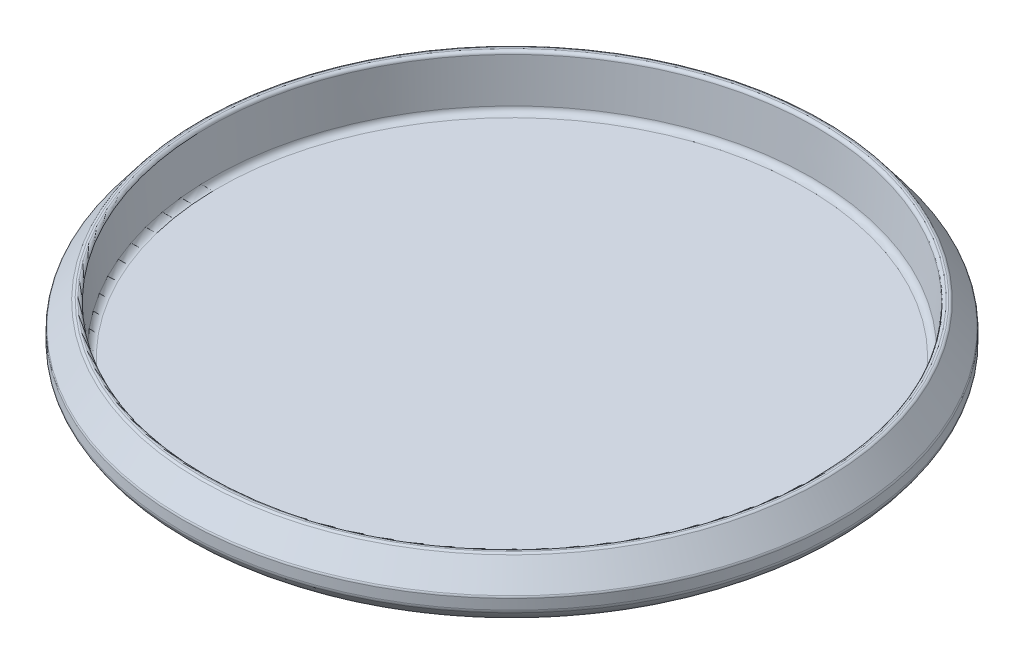
ISO-10303-21;
HEADER;
FILE_DESCRIPTION(('STEP AP214'),'2;1');
FILE_NAME('part.step','',(''),(''),'','','');
FILE_SCHEMA(('AUTOMOTIVE_DESIGN { 1 0 10303 214 1 1 1 1 }'));
ENDSEC;
DATA;
#1=APPLICATION_CONTEXT('core data for automotive mechanical design processes');
#2=APPLICATION_PROTOCOL_DEFINITION('international standard','automotive_design',2000,#1);
#3=PRODUCT_CONTEXT('',#1,'mechanical');
#4=PRODUCT('Part','Part','',(#3));
#5=PRODUCT_RELATED_PRODUCT_CATEGORY('part','',(#4));
#6=PRODUCT_DEFINITION_FORMATION('','',#4);
#7=PRODUCT_DEFINITION_CONTEXT('part definition',#1,'design');
#8=PRODUCT_DEFINITION('design','',#6,#7);
#9=PRODUCT_DEFINITION_SHAPE('','',#8);
#10=(LENGTH_UNIT() NAMED_UNIT(*) SI_UNIT(.MILLI.,.METRE.));
#11=(NAMED_UNIT(*) PLANE_ANGLE_UNIT() SI_UNIT($,.RADIAN.));
#12=(NAMED_UNIT(*) SI_UNIT($,.STERADIAN.) SOLID_ANGLE_UNIT());
#13=UNCERTAINTY_MEASURE_WITH_UNIT(LENGTH_MEASURE(1.E-05),#10,'distance_accuracy_value','');
#14=(GEOMETRIC_REPRESENTATION_CONTEXT(3) GLOBAL_UNCERTAINTY_ASSIGNED_CONTEXT((#13)) GLOBAL_UNIT_ASSIGNED_CONTEXT((#10,
#11,#12)) REPRESENTATION_CONTEXT('',''));
#15=CARTESIAN_POINT('',(0.,0.,0.));
#16=DIRECTION('',(0.,0.,1.));
#17=DIRECTION('',(1.,0.,0.));
#18=AXIS2_PLACEMENT_3D('',#15,#16,#17);
#19=CARTESIAN_POINT('',(0.,1.5,0.));
#20=DIRECTION('',(0.,1.,0.));
#21=DIRECTION('',(0.,0.,1.));
#22=AXIS2_PLACEMENT_3D('',#19,#20,#21);
#23=PLANE('',#22);
#24=CARTESIAN_POINT('',(0.,1.5,0.));
#25=DIRECTION('',(0.,1.,0.));
#26=DIRECTION('',(0.,0.,1.));
#27=AXIS2_PLACEMENT_3D('',#24,#25,#26);
#28=CIRCLE('',#27,93.1673376519652);
#29=CARTESIAN_POINT('',(0.,1.5,93.1673376519652));
#30=VERTEX_POINT('',#29);
#31=EDGE_CURVE('E10',#30,#30,#28,.T.);
#32=ORIENTED_EDGE('',*,*,#31,.T.);
#33=EDGE_LOOP('',(#32));
#34=FACE_BOUND('',#33,.T.);
#35=ADVANCED_FACE('F36',(#34),#23,.T.);
#36=CARTESIAN_POINT('',(0.,9.51678039252937,0.));
#37=DIRECTION('',(0.,-1.,0.));
#38=DIRECTION('',(0.,0.,-1.));
#39=AXIS2_PLACEMENT_3D('',#36,#37,#38);
#40=TOROIDAL_SURFACE('',#39,95.7578090940791,9.54690440209288);
#41=CARTESIAN_POINT('',(0.,5.13071645101927,0.));
#42=DIRECTION('',(0.,1.,0.));
#43=DIRECTION('',(0.,0.,1.));
#44=AXIS2_PLACEMENT_3D('',#41,#42,#43);
#45=CIRCLE('',#44,104.237539441424);
#46=CARTESIAN_POINT('',(0.,5.13071645101927,104.237539441424));
#47=VERTEX_POINT('',#46);
#48=EDGE_CURVE('E54',#47,#47,#45,.F.);
#49=ORIENTED_EDGE('',*,*,#48,.T.);
#50=EDGE_LOOP('',(#49));
#51=FACE_BOUND('',#50,.T.);
#52=CARTESIAN_POINT('',(0.,0.,0.));
#53=DIRECTION('',(0.,1.,0.));
#54=DIRECTION('',(0.,0.,1.));
#55=AXIS2_PLACEMENT_3D('',#52,#53,#54);
#56=CIRCLE('',#55,95.);
#57=CARTESIAN_POINT('',(0.,0.,95.));
#58=VERTEX_POINT('',#57);
#59=EDGE_CURVE('E84',#58,#58,#56,.T.);
#60=ORIENTED_EDGE('',*,*,#59,.T.);
#61=EDGE_LOOP('',(#60));
#62=FACE_BOUND('',#61,.T.);
#63=ADVANCED_FACE('F89',(#51,#62),#40,.T.);
#64=CARTESIAN_POINT('',(0.,0.,0.));
#65=DIRECTION('',(0.,-1.,0.));
#66=DIRECTION('',(0.,0.,-1.));
#67=AXIS2_PLACEMENT_3D('',#64,#65,#66);
#68=CYLINDRICAL_SURFACE('',#67,104.461103857658);
#69=CARTESIAN_POINT('',(0.,6.04956171368853,0.));
#70=DIRECTION('',(0.,1.,0.));
#71=DIRECTION('',(0.,0.,1.));
#72=AXIS2_PLACEMENT_3D('',#69,#70,#71);
#73=CIRCLE('',#72,104.461103857658);
#74=CARTESIAN_POINT('',(0.,6.04956171368853,104.461103857658));
#75=VERTEX_POINT('',#74);
#76=EDGE_CURVE('E49',#75,#75,#73,.T.);
#77=ORIENTED_EDGE('',*,*,#76,.T.);
#78=EDGE_LOOP('',(#77));
#79=FACE_BOUND('',#78,.T.);
#80=CARTESIAN_POINT('',(0.,9.25570026220736,0.));
#81=DIRECTION('',(0.,1.,0.));
#82=DIRECTION('',(0.,0.,1.));
#83=AXIS2_PLACEMENT_3D('',#80,#81,#82);
#84=CIRCLE('',#83,104.461103857658);
#85=CARTESIAN_POINT('',(0.,9.25570026220736,104.461103857658));
#86=VERTEX_POINT('',#85);
#87=EDGE_CURVE('E64',#86,#86,#84,.F.);
#88=ORIENTED_EDGE('',*,*,#87,.T.);
#89=EDGE_LOOP('',(#88));
#90=FACE_BOUND('',#89,.T.);
#91=ADVANCED_FACE('F112',(#79,#90),#68,.T.);
#92=CARTESIAN_POINT('',(0.,9.5930011019782,0.));
#93=DIRECTION('',(0.,-1.,0.));
#94=DIRECTION('',(0.,0.,-1.));
#95=AXIS2_PLACEMENT_3D('',#92,#93,#94);
#96=CONICAL_SURFACE('',#95,104.461103857658,0.650634100044437);
#97=CARTESIAN_POINT('',(0.,9.86139134301403,0.));
#98=DIRECTION('',(0.,1.,0.));
#99=DIRECTION('',(0.,0.,1.));
#100=AXIS2_PLACEMENT_3D('',#97,#98,#99);
#101=CIRCLE('',#100,104.25680374746);
#102=CARTESIAN_POINT('',(0.,9.86139134301403,104.25680374746));
#103=VERTEX_POINT('',#102);
#104=EDGE_CURVE('E60',#103,#103,#101,.T.);
#105=ORIENTED_EDGE('',*,*,#104,.T.);
#106=EDGE_LOOP('',(#105));
#107=FACE_BOUND('',#106,.T.);
#108=CARTESIAN_POINT('',(0.,17.1556910808067,0.));
#109=DIRECTION('',(0.,1.,0.));
#110=DIRECTION('',(0.,0.,1.));
#111=AXIS2_PLACEMENT_3D('',#108,#109,#110);
#112=CIRCLE('',#111,98.7043431419799);
#113=CARTESIAN_POINT('',(0.,17.1556910808067,98.7043431419799));
#114=VERTEX_POINT('',#113);
#115=EDGE_CURVE('E68',#114,#114,#112,.F.);
#116=ORIENTED_EDGE('',*,*,#115,.T.);
#117=EDGE_LOOP('',(#116));
#118=FACE_BOUND('',#117,.T.);
#119=ADVANCED_FACE('F118',(#107,#118),#96,.T.);
#120=CARTESIAN_POINT('',(96.4041930495911,17.55,0.));
#121=DIRECTION('',(0.,1.,0.));
#122=DIRECTION('',(0.,0.,1.));
#123=AXIS2_PLACEMENT_3D('',#120,#121,#122);
#124=PLANE('',#123);
#125=CARTESIAN_POINT('',(0.,17.55,0.));
#126=DIRECTION('',(0.,1.,0.));
#127=DIRECTION('',(0.,0.,1.));
#128=AXIS2_PLACEMENT_3D('',#125,#126,#127);
#129=CIRCLE('',#128,97.3205242236085);
#130=CARTESIAN_POINT('',(0.,17.55,97.3205242236085));
#131=VERTEX_POINT('',#130);
#132=EDGE_CURVE('E76',#131,#131,#129,.F.);
#133=ORIENTED_EDGE('',*,*,#132,.T.);
#134=EDGE_LOOP('',(#133));
#135=FACE_BOUND('',#134,.T.);
#136=CARTESIAN_POINT('',(0.,17.55,0.));
#137=DIRECTION('',(0.,1.,0.));
#138=DIRECTION('',(0.,0.,1.));
#139=AXIS2_PLACEMENT_3D('',#136,#137,#138);
#140=CIRCLE('',#139,97.9086432521778);
#141=CARTESIAN_POINT('',(0.,17.55,97.9086432521778));
#142=VERTEX_POINT('',#141);
#143=EDGE_CURVE('E80',#142,#142,#140,.T.);
#144=ORIENTED_EDGE('',*,*,#143,.T.);
#145=EDGE_LOOP('',(#144));
#146=FACE_BOUND('',#145,.T.);
#147=ADVANCED_FACE('F104',(#135,#146),#124,.T.);
#148=CARTESIAN_POINT('',(0.,17.55,0.));
#149=DIRECTION('',(0.,1.,0.));
#150=DIRECTION('',(0.,0.,1.));
#151=AXIS2_PLACEMENT_3D('',#148,#149,#150);
#152=CONICAL_SURFACE('',#151,96.4041930495911,0.0872664625997164);
#153=CARTESIAN_POINT('',(0.,3.32568851450468,0.));
#154=DIRECTION('',(0.,1.,0.));
#155=DIRECTION('',(0.,0.,1.));
#156=AXIS2_PLACEMENT_3D('',#153,#154,#155);
#157=CIRCLE('',#156,95.1597270481487);
#158=CARTESIAN_POINT('',(0.,3.32568851450468,95.1597270481487));
#159=VERTEX_POINT('',#158);
#160=EDGE_CURVE('E44',#159,#159,#157,.F.);
#161=ORIENTED_EDGE('',*,*,#160,.T.);
#162=EDGE_LOOP('',(#161));
#163=FACE_BOUND('',#162,.T.);
#164=CARTESIAN_POINT('',(0.,16.6371557427476,0.));
#165=DIRECTION('',(0.,-1.,0.));
#166=DIRECTION('',(0.,0.,-1.));
#167=AXIS2_PLACEMENT_3D('',#164,#165,#166);
#168=CIRCLE('',#167,96.3243295255168);
#169=CARTESIAN_POINT('',(0.,16.6371557427476,-96.3243295255168));
#170=VERTEX_POINT('',#169);
#171=EDGE_CURVE('E72',#170,#170,#168,.F.);
#172=ORIENTED_EDGE('',*,*,#171,.T.);
#173=EDGE_LOOP('',(#172));
#174=FACE_BOUND('',#173,.T.);
#175=ADVANCED_FACE('F94',(#163,#174),#152,.F.);
#176=CARTESIAN_POINT('',(0.,0.,0.));
#177=DIRECTION('',(0.,1.,0.));
#178=DIRECTION('',(0.,0.,1.));
#179=AXIS2_PLACEMENT_3D('',#176,#177,#178);
#180=PLANE('',#179);
#181=ORIENTED_EDGE('',*,*,#59,.F.);
#182=EDGE_LOOP('',(#181));
#183=FACE_BOUND('',#182,.T.);
#184=ADVANCED_FACE('F91',(#183),#180,.F.);
#185=CARTESIAN_POINT('',(0.,16.55,0.));
#186=DIRECTION('',(0.,1.,0.));
#187=DIRECTION('',(0.,0.,1.));
#188=AXIS2_PLACEMENT_3D('',#185,#186,#187);
#189=TOROIDAL_SURFACE('',#188,97.3205242236085,1.);
#190=ORIENTED_EDGE('',*,*,#171,.F.);
#191=EDGE_LOOP('',(#190));
#192=FACE_BOUND('',#191,.T.);
#193=ORIENTED_EDGE('',*,*,#132,.F.);
#194=EDGE_LOOP('',(#193));
#195=FACE_BOUND('',#194,.T.);
#196=ADVANCED_FACE('F93',(#192,#195),#189,.T.);
#197=CARTESIAN_POINT('',(0.,16.55,0.));
#198=DIRECTION('',(0.,1.,0.));
#199=DIRECTION('',(0.,0.,1.));
#200=AXIS2_PLACEMENT_3D('',#197,#198,#199);
#201=TOROIDAL_SURFACE('',#200,97.9086432521778,1.);
#202=ORIENTED_EDGE('',*,*,#143,.F.);
#203=EDGE_LOOP('',(#202));
#204=FACE_BOUND('',#203,.T.);
#205=ORIENTED_EDGE('',*,*,#115,.F.);
#206=EDGE_LOOP('',(#205));
#207=FACE_BOUND('',#206,.T.);
#208=ADVANCED_FACE('F100',(#204,#207),#201,.T.);
#209=CARTESIAN_POINT('',(0.,9.25570026220736,0.));
#210=DIRECTION('',(0.,1.,0.));
#211=DIRECTION('',(0.,0.,1.));
#212=AXIS2_PLACEMENT_3D('',#209,#210,#211);
#213=TOROIDAL_SURFACE('',#212,103.461103857658,1.);
#214=ORIENTED_EDGE('',*,*,#104,.F.);
#215=EDGE_LOOP('',(#214));
#216=FACE_BOUND('',#215,.T.);
#217=ORIENTED_EDGE('',*,*,#87,.F.);
#218=EDGE_LOOP('',(#217));
#219=FACE_BOUND('',#218,.T.);
#220=ADVANCED_FACE('F133',(#216,#219),#213,.T.);
#221=CARTESIAN_POINT('',(0.,6.04956171368853,0.));
#222=DIRECTION('',(0.,1.,0.));
#223=DIRECTION('',(0.,0.,1.));
#224=AXIS2_PLACEMENT_3D('',#221,#222,#223);
#225=TOROIDAL_SURFACE('',#224,102.461103857658,2.);
#226=ORIENTED_EDGE('',*,*,#76,.F.);
#227=EDGE_LOOP('',(#226));
#228=FACE_BOUND('',#227,.T.);
#229=ORIENTED_EDGE('',*,*,#48,.F.);
#230=EDGE_LOOP('',(#229));
#231=FACE_BOUND('',#230,.T.);
#232=ADVANCED_FACE('F140',(#228,#231),#225,.T.);
#233=CARTESIAN_POINT('',(0.,3.5,0.));
#234=DIRECTION('',(0.,1.,0.));
#235=DIRECTION('',(0.,0.,1.));
#236=AXIS2_PLACEMENT_3D('',#233,#234,#235);
#237=TOROIDAL_SURFACE('',#236,93.1673376519652,2.);
#238=ORIENTED_EDGE('',*,*,#31,.F.);
#239=EDGE_LOOP('',(#238));
#240=FACE_BOUND('',#239,.T.);
#241=ORIENTED_EDGE('',*,*,#160,.F.);
#242=EDGE_LOOP('',(#241));
#243=FACE_BOUND('',#242,.T.);
#244=ADVANCED_FACE('F38',(#240,#243),#237,.F.);
#245=CLOSED_SHELL('',(#35,#63,#91,#119,#147,#175,#184,#196,#208,#220,#232,#244));
#246=MANIFOLD_SOLID_BREP('B2',#245);
#247=ADVANCED_BREP_SHAPE_REPRESENTATION('',(#18,#246),#14);
#248=SHAPE_DEFINITION_REPRESENTATION(#9,#247);
ENDSEC;
END-ISO-10303-21;
